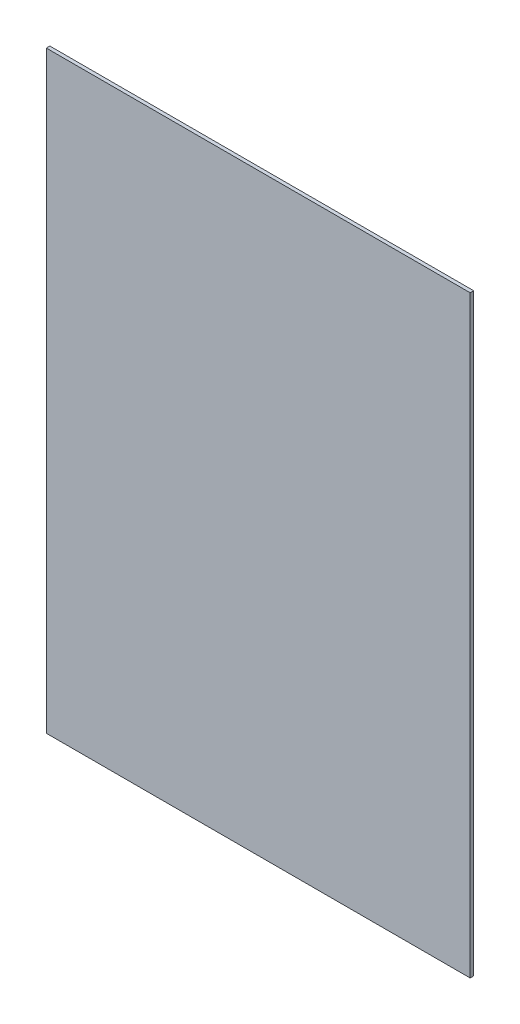
ISO-10303-21;
HEADER;
FILE_DESCRIPTION(('STEP AP214'),'2;1');
FILE_NAME('part.step','',(''),(''),'','','');
FILE_SCHEMA(('AUTOMOTIVE_DESIGN { 1 0 10303 214 1 1 1 1 }'));
ENDSEC;
DATA;
#1=APPLICATION_CONTEXT('core data for automotive mechanical design processes');
#2=APPLICATION_PROTOCOL_DEFINITION('international standard','automotive_design',2000,#1);
#3=PRODUCT_CONTEXT('',#1,'mechanical');
#4=PRODUCT('Part','Part','',(#3));
#5=PRODUCT_RELATED_PRODUCT_CATEGORY('part','',(#4));
#6=PRODUCT_DEFINITION_FORMATION('','',#4);
#7=PRODUCT_DEFINITION_CONTEXT('part definition',#1,'design');
#8=PRODUCT_DEFINITION('design','',#6,#7);
#9=PRODUCT_DEFINITION_SHAPE('','',#8);
#10=(LENGTH_UNIT() NAMED_UNIT(*) SI_UNIT(.MILLI.,.METRE.));
#11=(NAMED_UNIT(*) PLANE_ANGLE_UNIT() SI_UNIT($,.RADIAN.));
#12=(NAMED_UNIT(*) SI_UNIT($,.STERADIAN.) SOLID_ANGLE_UNIT());
#13=UNCERTAINTY_MEASURE_WITH_UNIT(LENGTH_MEASURE(1.E-05),#10,'distance_accuracy_value','');
#14=(GEOMETRIC_REPRESENTATION_CONTEXT(3) GLOBAL_UNCERTAINTY_ASSIGNED_CONTEXT((#13)) GLOBAL_UNIT_ASSIGNED_CONTEXT((#10,
#11,#12)) REPRESENTATION_CONTEXT('',''));
#15=CARTESIAN_POINT('',(0.,0.,0.));
#16=DIRECTION('',(0.,0.,1.));
#17=DIRECTION('',(1.,0.,0.));
#18=AXIS2_PLACEMENT_3D('',#15,#16,#17);
#19=CARTESIAN_POINT('',(0.,0.,3.175));
#20=DIRECTION('',(1.,0.,0.));
#21=DIRECTION('',(0.,0.,-1.));
#22=AXIS2_PLACEMENT_3D('',#19,#20,#21);
#23=PLANE('',#22);
#24=DIRECTION('',(0.,-1.,0.));
#25=VECTOR('',#24,1.);
#26=CARTESIAN_POINT('',(0.,0.,0.));
#27=LINE('',#26,#25);
#28=CARTESIAN_POINT('',(0.,533.4,0.));
#29=VERTEX_POINT('',#28);
#30=CARTESIAN_POINT('',(0.,0.,0.));
#31=VERTEX_POINT('',#30);
#32=EDGE_CURVE('E96',#29,#31,#27,.T.);
#33=ORIENTED_EDGE('',*,*,#32,.T.);
#34=DIRECTION('',(0.,0.,-1.));
#35=VECTOR('',#34,1.);
#36=CARTESIAN_POINT('',(0.,0.,3.175));
#37=LINE('',#36,#35);
#38=CARTESIAN_POINT('',(0.,0.,3.175));
#39=VERTEX_POINT('',#38);
#40=EDGE_CURVE('E11',#39,#31,#37,.T.);
#41=ORIENTED_EDGE('',*,*,#40,.F.);
#42=DIRECTION('',(0.,-1.,0.));
#43=VECTOR('',#42,1.);
#44=CARTESIAN_POINT('',(0.,0.,3.175));
#45=LINE('',#44,#43);
#46=CARTESIAN_POINT('',(0.,533.4,3.175));
#47=VERTEX_POINT('',#46);
#48=EDGE_CURVE('E84',#47,#39,#45,.T.);
#49=ORIENTED_EDGE('',*,*,#48,.F.);
#50=DIRECTION('',(0.,0.,-1.));
#51=VECTOR('',#50,1.);
#52=CARTESIAN_POINT('',(0.,533.4,3.175));
#53=LINE('',#52,#51);
#54=EDGE_CURVE('E92',#47,#29,#53,.T.);
#55=ORIENTED_EDGE('',*,*,#54,.T.);
#56=EDGE_LOOP('',(#33,#41,#49,#55));
#57=FACE_BOUND('',#56,.T.);
#58=ADVANCED_FACE('F33',(#57),#23,.F.);
#59=CARTESIAN_POINT('',(0.,0.,3.175));
#60=DIRECTION('',(0.,1.,0.));
#61=DIRECTION('',(0.,0.,1.));
#62=AXIS2_PLACEMENT_3D('',#59,#60,#61);
#63=PLANE('',#62);
#64=DIRECTION('',(1.,0.,0.));
#65=VECTOR('',#64,1.);
#66=CARTESIAN_POINT('',(0.,0.,0.));
#67=LINE('',#66,#65);
#68=CARTESIAN_POINT('',(381.,0.,0.));
#69=VERTEX_POINT('',#68);
#70=EDGE_CURVE('E88',#31,#69,#67,.T.);
#71=ORIENTED_EDGE('',*,*,#70,.T.);
#72=DIRECTION('',(0.,0.,-1.));
#73=VECTOR('',#72,1.);
#74=CARTESIAN_POINT('',(381.,0.,3.175));
#75=LINE('',#74,#73);
#76=CARTESIAN_POINT('',(381.,0.,3.175));
#77=VERTEX_POINT('',#76);
#78=EDGE_CURVE('E41',#77,#69,#75,.T.);
#79=ORIENTED_EDGE('',*,*,#78,.F.);
#80=DIRECTION('',(1.,0.,0.));
#81=VECTOR('',#80,1.);
#82=CARTESIAN_POINT('',(0.,0.,3.175));
#83=LINE('',#82,#81);
#84=EDGE_CURVE('E79',#39,#77,#83,.T.);
#85=ORIENTED_EDGE('',*,*,#84,.F.);
#86=ORIENTED_EDGE('',*,*,#40,.T.);
#87=EDGE_LOOP('',(#71,#79,#85,#86));
#88=FACE_BOUND('',#87,.T.);
#89=ADVANCED_FACE('F87',(#88),#63,.F.);
#90=CARTESIAN_POINT('',(381.,0.,3.175));
#91=DIRECTION('',(-1.,0.,0.));
#92=DIRECTION('',(0.,0.,1.));
#93=AXIS2_PLACEMENT_3D('',#90,#91,#92);
#94=PLANE('',#93);
#95=DIRECTION('',(0.,1.,0.));
#96=VECTOR('',#95,1.);
#97=CARTESIAN_POINT('',(381.,0.,0.));
#98=LINE('',#97,#96);
#99=CARTESIAN_POINT('',(381.,533.4,0.));
#100=VERTEX_POINT('',#99);
#101=EDGE_CURVE('E66',#69,#100,#98,.T.);
#102=ORIENTED_EDGE('',*,*,#101,.T.);
#103=DIRECTION('',(0.,0.,-1.));
#104=VECTOR('',#103,1.);
#105=CARTESIAN_POINT('',(381.,533.4,3.175));
#106=LINE('',#105,#104);
#107=CARTESIAN_POINT('',(381.,533.4,3.175));
#108=VERTEX_POINT('',#107);
#109=EDGE_CURVE('E89',#108,#100,#106,.T.);
#110=ORIENTED_EDGE('',*,*,#109,.F.);
#111=DIRECTION('',(0.,1.,0.));
#112=VECTOR('',#111,1.);
#113=CARTESIAN_POINT('',(381.,0.,3.175));
#114=LINE('',#113,#112);
#115=EDGE_CURVE('E82',#77,#108,#114,.T.);
#116=ORIENTED_EDGE('',*,*,#115,.F.);
#117=ORIENTED_EDGE('',*,*,#78,.T.);
#118=EDGE_LOOP('',(#102,#110,#116,#117));
#119=FACE_BOUND('',#118,.T.);
#120=ADVANCED_FACE('F90',(#119),#94,.F.);
#121=CARTESIAN_POINT('',(0.,533.4,3.175));
#122=DIRECTION('',(0.,-1.,0.));
#123=DIRECTION('',(0.,0.,-1.));
#124=AXIS2_PLACEMENT_3D('',#121,#122,#123);
#125=PLANE('',#124);
#126=DIRECTION('',(-1.,0.,0.));
#127=VECTOR('',#126,1.);
#128=CARTESIAN_POINT('',(0.,533.4,0.));
#129=LINE('',#128,#127);
#130=EDGE_CURVE('E72',#100,#29,#129,.T.);
#131=ORIENTED_EDGE('',*,*,#130,.T.);
#132=ORIENTED_EDGE('',*,*,#54,.F.);
#133=DIRECTION('',(-1.,0.,0.));
#134=VECTOR('',#133,1.);
#135=CARTESIAN_POINT('',(0.,533.4,3.175));
#136=LINE('',#135,#134);
#137=EDGE_CURVE('E49',#108,#47,#136,.T.);
#138=ORIENTED_EDGE('',*,*,#137,.F.);
#139=ORIENTED_EDGE('',*,*,#109,.T.);
#140=EDGE_LOOP('',(#131,#132,#138,#139));
#141=FACE_BOUND('',#140,.T.);
#142=ADVANCED_FACE('F103',(#141),#125,.F.);
#143=CARTESIAN_POINT('',(0.,0.,3.175));
#144=DIRECTION('',(0.,0.,-1.));
#145=DIRECTION('',(-1.,0.,0.));
#146=AXIS2_PLACEMENT_3D('',#143,#144,#145);
#147=PLANE('',#146);
#148=ORIENTED_EDGE('',*,*,#48,.T.);
#149=ORIENTED_EDGE('',*,*,#84,.T.);
#150=ORIENTED_EDGE('',*,*,#115,.T.);
#151=ORIENTED_EDGE('',*,*,#137,.T.);
#152=EDGE_LOOP('',(#148,#149,#150,#151));
#153=FACE_BOUND('',#152,.T.);
#154=ADVANCED_FACE('F80',(#153),#147,.F.);
#155=CARTESIAN_POINT('',(0.,0.,0.));
#156=DIRECTION('',(0.,0.,-1.));
#157=DIRECTION('',(-1.,0.,0.));
#158=AXIS2_PLACEMENT_3D('',#155,#156,#157);
#159=PLANE('',#158);
#160=ORIENTED_EDGE('',*,*,#32,.F.);
#161=ORIENTED_EDGE('',*,*,#130,.F.);
#162=ORIENTED_EDGE('',*,*,#101,.F.);
#163=ORIENTED_EDGE('',*,*,#70,.F.);
#164=EDGE_LOOP('',(#160,#161,#162,#163));
#165=FACE_BOUND('',#164,.T.);
#166=ADVANCED_FACE('F106',(#165),#159,.T.);
#167=CLOSED_SHELL('',(#58,#89,#120,#142,#154,#166));
#168=MANIFOLD_SOLID_BREP('B2',#167);
#169=ADVANCED_BREP_SHAPE_REPRESENTATION('',(#18,#168),#14);
#170=SHAPE_DEFINITION_REPRESENTATION(#9,#169);
ENDSEC;
END-ISO-10303-21;
